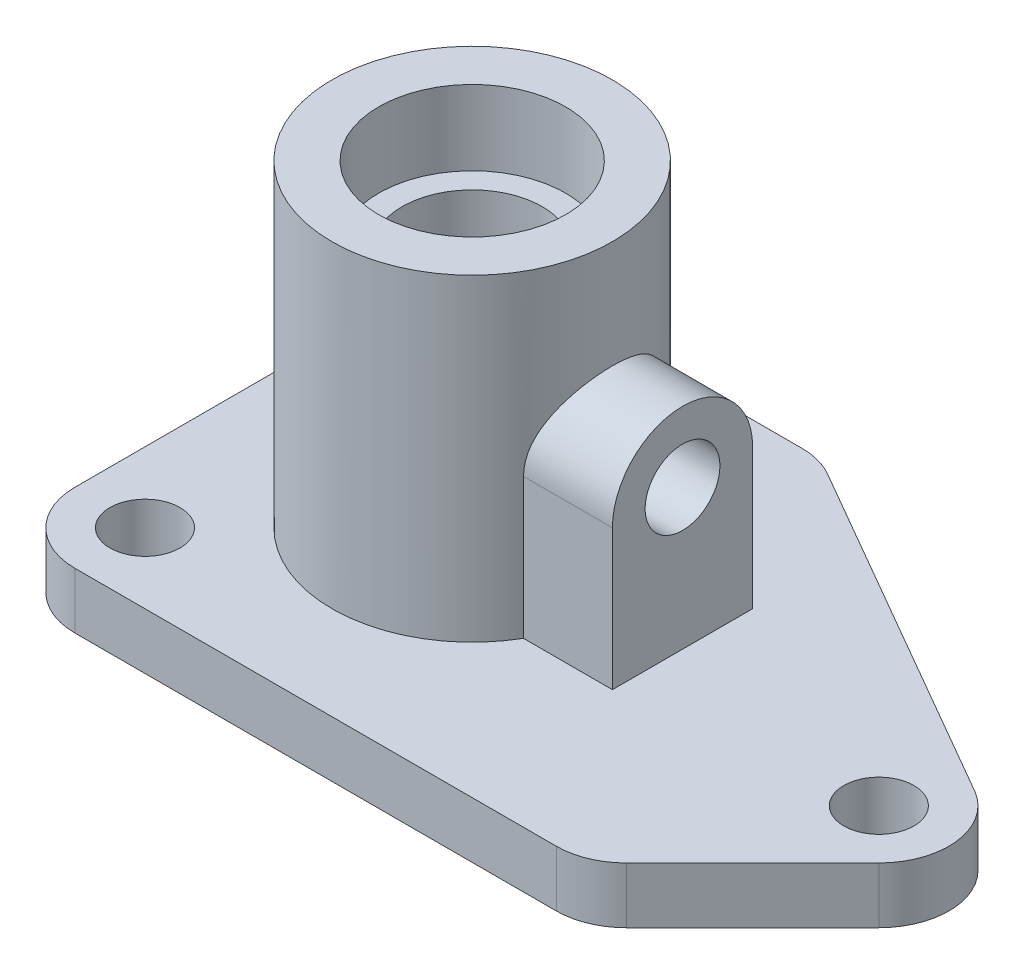
ISO-10303-21;
HEADER;
FILE_DESCRIPTION(('STEP AP214'),'2;1');
FILE_NAME('part.step','',(''),(''),'','','');
FILE_SCHEMA(('AUTOMOTIVE_DESIGN { 1 0 10303 214 1 1 1 1 }'));
ENDSEC;
DATA;
#1=APPLICATION_CONTEXT('core data for automotive mechanical design processes');
#2=APPLICATION_PROTOCOL_DEFINITION('international standard','automotive_design',2000,#1);
#3=PRODUCT_CONTEXT('',#1,'mechanical');
#4=PRODUCT('Part','Part','',(#3));
#5=PRODUCT_RELATED_PRODUCT_CATEGORY('part','',(#4));
#6=PRODUCT_DEFINITION_FORMATION('','',#4);
#7=PRODUCT_DEFINITION_CONTEXT('part definition',#1,'design');
#8=PRODUCT_DEFINITION('design','',#6,#7);
#9=PRODUCT_DEFINITION_SHAPE('','',#8);
#10=(LENGTH_UNIT() NAMED_UNIT(*) SI_UNIT(.MILLI.,.METRE.));
#11=(NAMED_UNIT(*) PLANE_ANGLE_UNIT() SI_UNIT($,.RADIAN.));
#12=(NAMED_UNIT(*) SI_UNIT($,.STERADIAN.) SOLID_ANGLE_UNIT());
#13=UNCERTAINTY_MEASURE_WITH_UNIT(LENGTH_MEASURE(1.E-05),#10,'distance_accuracy_value','');
#14=(GEOMETRIC_REPRESENTATION_CONTEXT(3) GLOBAL_UNCERTAINTY_ASSIGNED_CONTEXT((#13)) GLOBAL_UNIT_ASSIGNED_CONTEXT((#10,
#11,#12)) REPRESENTATION_CONTEXT('',''));
#15=CARTESIAN_POINT('',(0.,0.,0.));
#16=DIRECTION('',(0.,0.,1.));
#17=DIRECTION('',(1.,0.,0.));
#18=AXIS2_PLACEMENT_3D('',#15,#16,#17);
#19=CARTESIAN_POINT('',(68.0000000000001,12.,35.));
#20=DIRECTION('',(0.,1.,0.));
#21=DIRECTION('',(0.,0.,1.));
#22=AXIS2_PLACEMENT_3D('',#19,#20,#21);
#23=PLANE('',#22);
#24=DIRECTION('',(1.,0.,0.));
#25=VECTOR('',#24,1.);
#26=CARTESIAN_POINT('',(-50.001,12.,15.));
#27=LINE('',#26,#25);
#28=CARTESIAN_POINT('',(25.9807621135332,12.,15.));
#29=VERTEX_POINT('',#28);
#30=CARTESIAN_POINT('',(45.,12.,15.));
#31=VERTEX_POINT('',#30);
#32=EDGE_CURVE('E264',#29,#31,#27,.T.);
#33=ORIENTED_EDGE('',*,*,#32,.F.);
#34=CARTESIAN_POINT('',(0.,12.,0.));
#35=DIRECTION('',(0.,1.,0.));
#36=DIRECTION('',(0.,0.,1.));
#37=AXIS2_PLACEMENT_3D('',#34,#35,#36);
#38=CIRCLE('',#37,30.);
#39=CARTESIAN_POINT('',(25.9807621135332,12.,-15.));
#40=VERTEX_POINT('',#39);
#41=EDGE_CURVE('E239',#40,#29,#38,.T.);
#42=ORIENTED_EDGE('',*,*,#41,.F.);
#43=DIRECTION('',(1.,0.,0.));
#44=VECTOR('',#43,1.);
#45=CARTESIAN_POINT('',(-50.001,12.,-15.));
#46=LINE('',#45,#44);
#47=CARTESIAN_POINT('',(45.,12.,-15.));
#48=VERTEX_POINT('',#47);
#49=EDGE_CURVE('E268',#40,#48,#46,.T.);
#50=ORIENTED_EDGE('',*,*,#49,.T.);
#51=DIRECTION('',(0.,0.,-1.));
#52=VECTOR('',#51,1.);
#53=CARTESIAN_POINT('',(45.,12.,15.));
#54=LINE('',#53,#52);
#55=EDGE_CURVE('E274',#31,#48,#54,.T.);
#56=ORIENTED_EDGE('',*,*,#55,.F.);
#57=EDGE_LOOP('',(#33,#42,#50,#56));
#58=FACE_BOUND('',#57,.T.);
#59=CARTESIAN_POINT('',(-35.,12.,-35.));
#60=DIRECTION('',(0.,1.,0.));
#61=DIRECTION('',(0.,0.,1.));
#62=AXIS2_PLACEMENT_3D('',#59,#60,#61);
#63=CIRCLE('',#62,7.5);
#64=CARTESIAN_POINT('',(-35.,12.,-27.5));
#65=VERTEX_POINT('',#64);
#66=EDGE_CURVE('E224',#65,#65,#63,.T.);
#67=ORIENTED_EDGE('',*,*,#66,.F.);
#68=EDGE_LOOP('',(#67));
#69=FACE_BOUND('',#68,.T.);
#70=CARTESIAN_POINT('',(68.0000000000001,12.,35.));
#71=DIRECTION('',(0.,1.,0.));
#72=DIRECTION('',(0.,0.,1.));
#73=AXIS2_PLACEMENT_3D('',#70,#71,#72);
#74=CIRCLE('',#73,15.);
#75=CARTESIAN_POINT('',(68.0000000000001,12.,50.));
#76=VERTEX_POINT('',#75);
#77=CARTESIAN_POINT('',(78.6066017177983,12.,45.6066017177982));
#78=VERTEX_POINT('',#77);
#79=EDGE_CURVE('E173',#76,#78,#74,.T.);
#80=ORIENTED_EDGE('',*,*,#79,.T.);
#81=DIRECTION('',(0.707106781186547,0.,-0.707106781186548));
#82=VECTOR('',#81,1.);
#83=CARTESIAN_POINT('',(78.6066017177983,12.,45.6066017177982));
#84=LINE('',#83,#82);
#85=CARTESIAN_POINT('',(105.606601717798,12.,18.6066017177982));
#86=VERTEX_POINT('',#85);
#87=EDGE_CURVE('E104',#78,#86,#84,.T.);
#88=ORIENTED_EDGE('',*,*,#87,.T.);
#89=CARTESIAN_POINT('',(95.,12.,8.));
#90=DIRECTION('',(0.,1.,0.));
#91=DIRECTION('',(0.,0.,1.));
#92=AXIS2_PLACEMENT_3D('',#89,#90,#91);
#93=CIRCLE('',#92,15.);
#94=CARTESIAN_POINT('',(102.5,12.,-4.99038105676657));
#95=VERTEX_POINT('',#94);
#96=EDGE_CURVE('E194',#86,#95,#93,.T.);
#97=ORIENTED_EDGE('',*,*,#96,.T.);
#98=DIRECTION('',(-0.866025403784438,0.,-0.500000000000001));
#99=VECTOR('',#98,1.);
#100=CARTESIAN_POINT('',(28.0218152745385,12.,-47.9903810567666));
#101=LINE('',#100,#99);
#102=CARTESIAN_POINT('',(28.0218152745385,12.,-47.9903810567666));
#103=VERTEX_POINT('',#102);
#104=EDGE_CURVE('E213',#95,#103,#101,.T.);
#105=ORIENTED_EDGE('',*,*,#104,.T.);
#106=CARTESIAN_POINT('',(20.5218152745385,12.,-35.));
#107=DIRECTION('',(0.,1.,0.));
#108=DIRECTION('',(0.,0.,-1.));
#109=AXIS2_PLACEMENT_3D('',#106,#107,#108);
#110=CIRCLE('',#109,15.);
#111=CARTESIAN_POINT('',(20.5218152745385,12.,-50.));
#112=VERTEX_POINT('',#111);
#113=EDGE_CURVE('E210',#103,#112,#110,.T.);
#114=ORIENTED_EDGE('',*,*,#113,.T.);
#115=DIRECTION('',(-1.,0.,0.));
#116=VECTOR('',#115,1.);
#117=CARTESIAN_POINT('',(-34.9999999999999,12.,-50.));
#118=LINE('',#117,#116);
#119=CARTESIAN_POINT('',(-35.,12.,-50.));
#120=VERTEX_POINT('',#119);
#121=EDGE_CURVE('E212',#112,#120,#118,.T.);
#122=ORIENTED_EDGE('',*,*,#121,.T.);
#123=CARTESIAN_POINT('',(-35.,12.,-35.));
#124=DIRECTION('',(0.,1.,0.));
#125=DIRECTION('',(0.,0.,-1.));
#126=AXIS2_PLACEMENT_3D('',#123,#124,#125);
#127=CIRCLE('',#126,15.);
#128=CARTESIAN_POINT('',(-50.,12.,-34.9999999999999));
#129=VERTEX_POINT('',#128);
#130=EDGE_CURVE('E132',#120,#129,#127,.T.);
#131=ORIENTED_EDGE('',*,*,#130,.T.);
#132=DIRECTION('',(0.,0.,1.));
#133=VECTOR('',#132,1.);
#134=CARTESIAN_POINT('',(-50.,12.,-34.9999999999999));
#135=LINE('',#134,#133);
#136=CARTESIAN_POINT('',(-50.,12.,34.9999999999999));
#137=VERTEX_POINT('',#136);
#138=EDGE_CURVE('E125',#129,#137,#135,.T.);
#139=ORIENTED_EDGE('',*,*,#138,.T.);
#140=CARTESIAN_POINT('',(-35.,12.,35.));
#141=DIRECTION('',(0.,1.,0.));
#142=DIRECTION('',(0.,0.,1.));
#143=AXIS2_PLACEMENT_3D('',#140,#141,#142);
#144=CIRCLE('',#143,15.);
#145=CARTESIAN_POINT('',(-34.9999999999999,12.,50.));
#146=VERTEX_POINT('',#145);
#147=EDGE_CURVE('E129',#137,#146,#144,.T.);
#148=ORIENTED_EDGE('',*,*,#147,.T.);
#149=DIRECTION('',(1.,0.,0.));
#150=VECTOR('',#149,1.);
#151=CARTESIAN_POINT('',(-34.9999999999999,12.,50.));
#152=LINE('',#151,#150);
#153=EDGE_CURVE('E57',#146,#76,#152,.T.);
#154=ORIENTED_EDGE('',*,*,#153,.T.);
#155=EDGE_LOOP('',(#80,#88,#97,#105,#114,#122,#131,#139,#148,#154));
#156=FACE_BOUND('',#155,.T.);
#157=CARTESIAN_POINT('',(95.,12.,8.));
#158=DIRECTION('',(0.,1.,0.));
#159=DIRECTION('',(0.,0.,1.));
#160=AXIS2_PLACEMENT_3D('',#157,#158,#159);
#161=CIRCLE('',#160,7.50000000000001);
#162=CARTESIAN_POINT('',(95.,12.,15.5));
#163=VERTEX_POINT('',#162);
#164=EDGE_CURVE('E157',#163,#163,#161,.T.);
#165=ORIENTED_EDGE('',*,*,#164,.F.);
#166=EDGE_LOOP('',(#165));
#167=FACE_BOUND('',#166,.T.);
#168=CARTESIAN_POINT('',(-35.,12.,35.));
#169=DIRECTION('',(0.,1.,0.));
#170=DIRECTION('',(0.,0.,1.));
#171=AXIS2_PLACEMENT_3D('',#168,#169,#170);
#172=CIRCLE('',#171,7.5);
#173=CARTESIAN_POINT('',(-35.,12.,42.5));
#174=VERTEX_POINT('',#173);
#175=EDGE_CURVE('E230',#174,#174,#172,.T.);
#176=ORIENTED_EDGE('',*,*,#175,.F.);
#177=EDGE_LOOP('',(#176));
#178=FACE_BOUND('',#177,.T.);
#179=ADVANCED_FACE('F33',(#58,#69,#156,#167,#178),#23,.T.);
#180=CARTESIAN_POINT('',(68.0000000000001,0.,35.));
#181=DIRECTION('',(0.,1.,0.));
#182=DIRECTION('',(0.,0.,1.));
#183=AXIS2_PLACEMENT_3D('',#180,#181,#182);
#184=PLANE('',#183);
#185=CARTESIAN_POINT('',(0.,0.,0.));
#186=DIRECTION('',(0.,1.,0.));
#187=DIRECTION('',(0.,0.,1.));
#188=AXIS2_PLACEMENT_3D('',#185,#186,#187);
#189=CIRCLE('',#188,15.);
#190=CARTESIAN_POINT('',(0.,0.,15.));
#191=VERTEX_POINT('',#190);
#192=EDGE_CURVE('E242',#191,#191,#189,.T.);
#193=ORIENTED_EDGE('',*,*,#192,.T.);
#194=EDGE_LOOP('',(#193));
#195=FACE_BOUND('',#194,.T.);
#196=CARTESIAN_POINT('',(68.0000000000001,0.,35.));
#197=DIRECTION('',(0.,1.,0.));
#198=DIRECTION('',(0.,0.,1.));
#199=AXIS2_PLACEMENT_3D('',#196,#197,#198);
#200=CIRCLE('',#199,15.);
#201=CARTESIAN_POINT('',(68.0000000000001,0.,50.));
#202=VERTEX_POINT('',#201);
#203=CARTESIAN_POINT('',(78.6066017177983,0.,45.6066017177982));
#204=VERTEX_POINT('',#203);
#205=EDGE_CURVE('E153',#202,#204,#200,.T.);
#206=ORIENTED_EDGE('',*,*,#205,.F.);
#207=DIRECTION('',(1.,0.,0.));
#208=VECTOR('',#207,1.);
#209=CARTESIAN_POINT('',(-34.9999999999999,0.,50.));
#210=LINE('',#209,#208);
#211=CARTESIAN_POINT('',(-34.9999999999999,0.,50.));
#212=VERTEX_POINT('',#211);
#213=EDGE_CURVE('E96',#212,#202,#210,.T.);
#214=ORIENTED_EDGE('',*,*,#213,.F.);
#215=CARTESIAN_POINT('',(-35.,0.,35.));
#216=DIRECTION('',(0.,1.,0.));
#217=DIRECTION('',(0.,0.,1.));
#218=AXIS2_PLACEMENT_3D('',#215,#216,#217);
#219=CIRCLE('',#218,15.);
#220=CARTESIAN_POINT('',(-50.,0.,34.9999999999999));
#221=VERTEX_POINT('',#220);
#222=EDGE_CURVE('E170',#221,#212,#219,.T.);
#223=ORIENTED_EDGE('',*,*,#222,.F.);
#224=DIRECTION('',(0.,0.,1.));
#225=VECTOR('',#224,1.);
#226=CARTESIAN_POINT('',(-50.,0.,-34.9999999999999));
#227=LINE('',#226,#225);
#228=CARTESIAN_POINT('',(-50.,0.,-34.9999999999999));
#229=VERTEX_POINT('',#228);
#230=EDGE_CURVE('E141',#229,#221,#227,.T.);
#231=ORIENTED_EDGE('',*,*,#230,.F.);
#232=CARTESIAN_POINT('',(-35.,0.,-35.));
#233=DIRECTION('',(0.,1.,0.));
#234=DIRECTION('',(0.,0.,-1.));
#235=AXIS2_PLACEMENT_3D('',#232,#233,#234);
#236=CIRCLE('',#235,15.);
#237=CARTESIAN_POINT('',(-35.,0.,-50.));
#238=VERTEX_POINT('',#237);
#239=EDGE_CURVE('E167',#238,#229,#236,.T.);
#240=ORIENTED_EDGE('',*,*,#239,.F.);
#241=DIRECTION('',(-1.,0.,0.));
#242=VECTOR('',#241,1.);
#243=CARTESIAN_POINT('',(-34.9999999999999,0.,-50.));
#244=LINE('',#243,#242);
#245=CARTESIAN_POINT('',(20.5218152745385,0.,-50.));
#246=VERTEX_POINT('',#245);
#247=EDGE_CURVE('E165',#246,#238,#244,.T.);
#248=ORIENTED_EDGE('',*,*,#247,.F.);
#249=CARTESIAN_POINT('',(20.5218152745385,0.,-35.));
#250=DIRECTION('',(0.,1.,0.));
#251=DIRECTION('',(0.,0.,-1.));
#252=AXIS2_PLACEMENT_3D('',#249,#250,#251);
#253=CIRCLE('',#252,15.);
#254=CARTESIAN_POINT('',(28.0218152745385,0.,-47.9903810567666));
#255=VERTEX_POINT('',#254);
#256=EDGE_CURVE('E163',#255,#246,#253,.T.);
#257=ORIENTED_EDGE('',*,*,#256,.F.);
#258=DIRECTION('',(-0.866025403784438,0.,-0.500000000000001));
#259=VECTOR('',#258,1.);
#260=CARTESIAN_POINT('',(28.0218152745385,0.,-47.9903810567666));
#261=LINE('',#260,#259);
#262=CARTESIAN_POINT('',(102.5,0.,-4.99038105676657));
#263=VERTEX_POINT('',#262);
#264=EDGE_CURVE('E161',#263,#255,#261,.T.);
#265=ORIENTED_EDGE('',*,*,#264,.F.);
#266=CARTESIAN_POINT('',(95.,0.,8.));
#267=DIRECTION('',(0.,1.,0.));
#268=DIRECTION('',(0.,0.,1.));
#269=AXIS2_PLACEMENT_3D('',#266,#267,#268);
#270=CIRCLE('',#269,15.);
#271=CARTESIAN_POINT('',(105.606601717798,0.,18.6066017177982));
#272=VERTEX_POINT('',#271);
#273=EDGE_CURVE('E159',#272,#263,#270,.T.);
#274=ORIENTED_EDGE('',*,*,#273,.F.);
#275=DIRECTION('',(0.707106781186547,0.,-0.707106781186548));
#276=VECTOR('',#275,1.);
#277=CARTESIAN_POINT('',(78.6066017177983,0.,45.6066017177982));
#278=LINE('',#277,#276);
#279=EDGE_CURVE('E156',#204,#272,#278,.T.);
#280=ORIENTED_EDGE('',*,*,#279,.F.);
#281=EDGE_LOOP('',(#206,#214,#223,#231,#240,#248,#257,#265,#274,#280));
#282=FACE_BOUND('',#281,.T.);
#283=CARTESIAN_POINT('',(95.,0.,8.));
#284=DIRECTION('',(0.,1.,0.));
#285=DIRECTION('',(0.,0.,1.));
#286=AXIS2_PLACEMENT_3D('',#283,#284,#285);
#287=CIRCLE('',#286,7.50000000000001);
#288=CARTESIAN_POINT('',(95.,0.,15.5));
#289=VERTEX_POINT('',#288);
#290=EDGE_CURVE('E221',#289,#289,#287,.T.);
#291=ORIENTED_EDGE('',*,*,#290,.T.);
#292=EDGE_LOOP('',(#291));
#293=FACE_BOUND('',#292,.T.);
#294=CARTESIAN_POINT('',(-35.,0.,-35.));
#295=DIRECTION('',(0.,1.,0.));
#296=DIRECTION('',(0.,0.,1.));
#297=AXIS2_PLACEMENT_3D('',#294,#295,#296);
#298=CIRCLE('',#297,7.5);
#299=CARTESIAN_POINT('',(-35.,0.,-27.5));
#300=VERTEX_POINT('',#299);
#301=EDGE_CURVE('E227',#300,#300,#298,.T.);
#302=ORIENTED_EDGE('',*,*,#301,.T.);
#303=EDGE_LOOP('',(#302));
#304=FACE_BOUND('',#303,.T.);
#305=CARTESIAN_POINT('',(-35.,0.,35.));
#306=DIRECTION('',(0.,1.,0.));
#307=DIRECTION('',(0.,0.,1.));
#308=AXIS2_PLACEMENT_3D('',#305,#306,#307);
#309=CIRCLE('',#308,7.5);
#310=CARTESIAN_POINT('',(-35.,0.,42.5));
#311=VERTEX_POINT('',#310);
#312=EDGE_CURVE('E233',#311,#311,#309,.T.);
#313=ORIENTED_EDGE('',*,*,#312,.T.);
#314=EDGE_LOOP('',(#313));
#315=FACE_BOUND('',#314,.T.);
#316=ADVANCED_FACE('F198',(#195,#282,#293,#304,#315),#184,.F.);
#317=CARTESIAN_POINT('',(68.0000000000001,12.,35.));
#318=DIRECTION('',(0.,-1.,0.));
#319=DIRECTION('',(0.,0.,-1.));
#320=AXIS2_PLACEMENT_3D('',#317,#318,#319);
#321=CYLINDRICAL_SURFACE('',#320,15.);
#322=ORIENTED_EDGE('',*,*,#205,.T.);
#323=DIRECTION('',(0.,-1.,0.));
#324=VECTOR('',#323,1.);
#325=CARTESIAN_POINT('',(78.6066017177983,12.,45.6066017177982));
#326=LINE('',#325,#324);
#327=EDGE_CURVE('E11',#78,#204,#326,.T.);
#328=ORIENTED_EDGE('',*,*,#327,.F.);
#329=ORIENTED_EDGE('',*,*,#79,.F.);
#330=DIRECTION('',(0.,-1.,0.));
#331=VECTOR('',#330,1.);
#332=CARTESIAN_POINT('',(68.0000000000001,12.,50.));
#333=LINE('',#332,#331);
#334=EDGE_CURVE('E149',#76,#202,#333,.T.);
#335=ORIENTED_EDGE('',*,*,#334,.T.);
#336=EDGE_LOOP('',(#322,#328,#329,#335));
#337=FACE_BOUND('',#336,.T.);
#338=ADVANCED_FACE('F35',(#337),#321,.T.);
#339=CARTESIAN_POINT('',(78.6066017177983,12.,45.6066017177982));
#340=DIRECTION('',(-0.707106781186548,0.,-0.707106781186547));
#341=DIRECTION('',(-0.707106781186547,0.,0.707106781186548));
#342=AXIS2_PLACEMENT_3D('',#339,#340,#341);
#343=PLANE('',#342);
#344=ORIENTED_EDGE('',*,*,#279,.T.);
#345=DIRECTION('',(0.,-1.,0.));
#346=VECTOR('',#345,1.);
#347=CARTESIAN_POINT('',(105.606601717798,12.,18.6066017177982));
#348=LINE('',#347,#346);
#349=EDGE_CURVE('E41',#86,#272,#348,.T.);
#350=ORIENTED_EDGE('',*,*,#349,.F.);
#351=ORIENTED_EDGE('',*,*,#87,.F.);
#352=ORIENTED_EDGE('',*,*,#327,.T.);
#353=EDGE_LOOP('',(#344,#350,#351,#352));
#354=FACE_BOUND('',#353,.T.);
#355=ADVANCED_FACE('F354',(#354),#343,.F.);
#356=CARTESIAN_POINT('',(95.,12.,8.));
#357=DIRECTION('',(0.,-1.,0.));
#358=DIRECTION('',(0.,0.,-1.));
#359=AXIS2_PLACEMENT_3D('',#356,#357,#358);
#360=CYLINDRICAL_SURFACE('',#359,15.);
#361=ORIENTED_EDGE('',*,*,#273,.T.);
#362=DIRECTION('',(0.,-1.,0.));
#363=VECTOR('',#362,1.);
#364=CARTESIAN_POINT('',(102.5,12.,-4.99038105676657));
#365=LINE('',#364,#363);
#366=EDGE_CURVE('E186',#95,#263,#365,.T.);
#367=ORIENTED_EDGE('',*,*,#366,.F.);
#368=ORIENTED_EDGE('',*,*,#96,.F.);
#369=ORIENTED_EDGE('',*,*,#349,.T.);
#370=EDGE_LOOP('',(#361,#367,#368,#369));
#371=FACE_BOUND('',#370,.T.);
#372=ADVANCED_FACE('F192',(#371),#360,.T.);
#373=CARTESIAN_POINT('',(28.0218152745385,12.,-47.9903810567666));
#374=DIRECTION('',(-0.500000000000001,0.,0.866025403784438));
#375=DIRECTION('',(0.866025403784438,0.,0.500000000000001));
#376=AXIS2_PLACEMENT_3D('',#373,#374,#375);
#377=PLANE('',#376);
#378=ORIENTED_EDGE('',*,*,#264,.T.);
#379=DIRECTION('',(0.,-1.,0.));
#380=VECTOR('',#379,1.);
#381=CARTESIAN_POINT('',(28.0218152745385,12.,-47.9903810567666));
#382=LINE('',#381,#380);
#383=EDGE_CURVE('E183',#103,#255,#382,.T.);
#384=ORIENTED_EDGE('',*,*,#383,.F.);
#385=ORIENTED_EDGE('',*,*,#104,.F.);
#386=ORIENTED_EDGE('',*,*,#366,.T.);
#387=EDGE_LOOP('',(#378,#384,#385,#386));
#388=FACE_BOUND('',#387,.T.);
#389=ADVANCED_FACE('F204',(#388),#377,.F.);
#390=CARTESIAN_POINT('',(20.5218152745385,12.,-35.));
#391=DIRECTION('',(0.,-1.,0.));
#392=DIRECTION('',(0.,0.,-1.));
#393=AXIS2_PLACEMENT_3D('',#390,#391,#392);
#394=CYLINDRICAL_SURFACE('',#393,15.);
#395=ORIENTED_EDGE('',*,*,#256,.T.);
#396=DIRECTION('',(0.,-1.,0.));
#397=VECTOR('',#396,1.);
#398=CARTESIAN_POINT('',(20.5218152745385,12.,-50.));
#399=LINE('',#398,#397);
#400=EDGE_CURVE('E180',#112,#246,#399,.T.);
#401=ORIENTED_EDGE('',*,*,#400,.F.);
#402=ORIENTED_EDGE('',*,*,#113,.F.);
#403=ORIENTED_EDGE('',*,*,#383,.T.);
#404=EDGE_LOOP('',(#395,#401,#402,#403));
#405=FACE_BOUND('',#404,.T.);
#406=ADVANCED_FACE('F208',(#405),#394,.T.);
#407=CARTESIAN_POINT('',(-34.9999999999999,12.,-50.));
#408=DIRECTION('',(0.,0.,1.));
#409=DIRECTION('',(1.,0.,0.));
#410=AXIS2_PLACEMENT_3D('',#407,#408,#409);
#411=PLANE('',#410);
#412=ORIENTED_EDGE('',*,*,#247,.T.);
#413=DIRECTION('',(0.,-1.,0.));
#414=VECTOR('',#413,1.);
#415=CARTESIAN_POINT('',(-35.,12.,-50.));
#416=LINE('',#415,#414);
#417=EDGE_CURVE('E177',#120,#238,#416,.T.);
#418=ORIENTED_EDGE('',*,*,#417,.F.);
#419=ORIENTED_EDGE('',*,*,#121,.F.);
#420=ORIENTED_EDGE('',*,*,#400,.T.);
#421=EDGE_LOOP('',(#412,#418,#419,#420));
#422=FACE_BOUND('',#421,.T.);
#423=ADVANCED_FACE('F344',(#422),#411,.F.);
#424=CARTESIAN_POINT('',(-35.,12.,-35.));
#425=DIRECTION('',(0.,-1.,0.));
#426=DIRECTION('',(0.,0.,-1.));
#427=AXIS2_PLACEMENT_3D('',#424,#425,#426);
#428=CYLINDRICAL_SURFACE('',#427,15.);
#429=ORIENTED_EDGE('',*,*,#239,.T.);
#430=DIRECTION('',(0.,-1.,0.));
#431=VECTOR('',#430,1.);
#432=CARTESIAN_POINT('',(-50.,12.,-34.9999999999999));
#433=LINE('',#432,#431);
#434=EDGE_CURVE('E144',#129,#229,#433,.T.);
#435=ORIENTED_EDGE('',*,*,#434,.F.);
#436=ORIENTED_EDGE('',*,*,#130,.F.);
#437=ORIENTED_EDGE('',*,*,#417,.T.);
#438=EDGE_LOOP('',(#429,#435,#436,#437));
#439=FACE_BOUND('',#438,.T.);
#440=ADVANCED_FACE('F341',(#439),#428,.T.);
#441=CARTESIAN_POINT('',(-50.,12.,-34.9999999999999));
#442=DIRECTION('',(1.,0.,0.));
#443=DIRECTION('',(0.,0.,-1.));
#444=AXIS2_PLACEMENT_3D('',#441,#442,#443);
#445=PLANE('',#444);
#446=ORIENTED_EDGE('',*,*,#230,.T.);
#447=DIRECTION('',(0.,-1.,0.));
#448=VECTOR('',#447,1.);
#449=CARTESIAN_POINT('',(-50.,12.,34.9999999999999));
#450=LINE('',#449,#448);
#451=EDGE_CURVE('E138',#137,#221,#450,.T.);
#452=ORIENTED_EDGE('',*,*,#451,.F.);
#453=ORIENTED_EDGE('',*,*,#138,.F.);
#454=ORIENTED_EDGE('',*,*,#434,.T.);
#455=EDGE_LOOP('',(#446,#452,#453,#454));
#456=FACE_BOUND('',#455,.T.);
#457=ADVANCED_FACE('F139',(#456),#445,.F.);
#458=CARTESIAN_POINT('',(-35.,12.,35.));
#459=DIRECTION('',(0.,-1.,0.));
#460=DIRECTION('',(0.,0.,-1.));
#461=AXIS2_PLACEMENT_3D('',#458,#459,#460);
#462=CYLINDRICAL_SURFACE('',#461,15.);
#463=ORIENTED_EDGE('',*,*,#222,.T.);
#464=DIRECTION('',(0.,-1.,0.));
#465=VECTOR('',#464,1.);
#466=CARTESIAN_POINT('',(-34.9999999999999,12.,50.));
#467=LINE('',#466,#465);
#468=EDGE_CURVE('E145',#146,#212,#467,.T.);
#469=ORIENTED_EDGE('',*,*,#468,.F.);
#470=ORIENTED_EDGE('',*,*,#147,.F.);
#471=ORIENTED_EDGE('',*,*,#451,.T.);
#472=EDGE_LOOP('',(#463,#469,#470,#471));
#473=FACE_BOUND('',#472,.T.);
#474=ADVANCED_FACE('F147',(#473),#462,.T.);
#475=CARTESIAN_POINT('',(-34.9999999999999,12.,50.));
#476=DIRECTION('',(0.,0.,-1.));
#477=DIRECTION('',(-1.,0.,0.));
#478=AXIS2_PLACEMENT_3D('',#475,#476,#477);
#479=PLANE('',#478);
#480=ORIENTED_EDGE('',*,*,#213,.T.);
#481=ORIENTED_EDGE('',*,*,#334,.F.);
#482=ORIENTED_EDGE('',*,*,#153,.F.);
#483=ORIENTED_EDGE('',*,*,#468,.T.);
#484=EDGE_LOOP('',(#480,#481,#482,#483));
#485=FACE_BOUND('',#484,.T.);
#486=ADVANCED_FACE('F334',(#485),#479,.F.);
#487=CARTESIAN_POINT('',(95.,12.,8.));
#488=DIRECTION('',(0.,-1.,0.));
#489=DIRECTION('',(0.,0.,-1.));
#490=AXIS2_PLACEMENT_3D('',#487,#488,#489);
#491=CYLINDRICAL_SURFACE('',#490,7.50000000000001);
#492=ORIENTED_EDGE('',*,*,#164,.T.);
#493=EDGE_LOOP('',(#492));
#494=FACE_BOUND('',#493,.T.);
#495=ORIENTED_EDGE('',*,*,#290,.F.);
#496=EDGE_LOOP('',(#495));
#497=FACE_BOUND('',#496,.T.);
#498=ADVANCED_FACE('F331',(#494,#497),#491,.F.);
#499=CARTESIAN_POINT('',(-35.,12.,-35.));
#500=DIRECTION('',(0.,-1.,0.));
#501=DIRECTION('',(0.,0.,-1.));
#502=AXIS2_PLACEMENT_3D('',#499,#500,#501);
#503=CYLINDRICAL_SURFACE('',#502,7.5);
#504=ORIENTED_EDGE('',*,*,#66,.T.);
#505=EDGE_LOOP('',(#504));
#506=FACE_BOUND('',#505,.T.);
#507=ORIENTED_EDGE('',*,*,#301,.F.);
#508=EDGE_LOOP('',(#507));
#509=FACE_BOUND('',#508,.T.);
#510=ADVANCED_FACE('F501',(#506,#509),#503,.F.);
#511=CARTESIAN_POINT('',(-35.,12.,35.));
#512=DIRECTION('',(0.,-1.,0.));
#513=DIRECTION('',(0.,0.,-1.));
#514=AXIS2_PLACEMENT_3D('',#511,#512,#513);
#515=CYLINDRICAL_SURFACE('',#514,7.5);
#516=ORIENTED_EDGE('',*,*,#175,.T.);
#517=EDGE_LOOP('',(#516));
#518=FACE_BOUND('',#517,.T.);
#519=ORIENTED_EDGE('',*,*,#312,.F.);
#520=EDGE_LOOP('',(#519));
#521=FACE_BOUND('',#520,.T.);
#522=ADVANCED_FACE('F377',(#518,#521),#515,.F.);
#523=CARTESIAN_POINT('',(0.,80.,0.));
#524=DIRECTION('',(0.,-1.,0.));
#525=DIRECTION('',(0.,0.,-1.));
#526=AXIS2_PLACEMENT_3D('',#523,#524,#525);
#527=CYLINDRICAL_SURFACE('',#526,30.);
#528=CARTESIAN_POINT('',(0.,80.,0.));
#529=DIRECTION('',(0.,1.,0.));
#530=DIRECTION('',(0.,0.,1.));
#531=AXIS2_PLACEMENT_3D('',#528,#529,#530);
#532=CIRCLE('',#531,30.);
#533=CARTESIAN_POINT('',(0.,80.,30.));
#534=VERTEX_POINT('',#533);
#535=EDGE_CURVE('E236',#534,#534,#532,.T.);
#536=ORIENTED_EDGE('',*,*,#535,.F.);
#537=EDGE_LOOP('',(#536));
#538=FACE_BOUND('',#537,.T.);
#539=ORIENTED_EDGE('',*,*,#41,.T.);
#540=DIRECTION('',(0.,-1.,0.));
#541=VECTOR('',#540,1.);
#542=CARTESIAN_POINT('',(25.9807621135332,80.,15.));
#543=LINE('',#542,#541);
#544=CARTESIAN_POINT('',(25.9807621135332,42.,15.));
#545=VERTEX_POINT('',#544);
#546=EDGE_CURVE('E257',#545,#29,#543,.T.);
#547=ORIENTED_EDGE('',*,*,#546,.F.);
#548=CARTESIAN_POINT('',(25.9807621135332,42.,-15.));
#549=CARTESIAN_POINT('',(25.9807576058378,42.1964211737014,-15.0000014586861));
#550=CARTESIAN_POINT('',(25.9829905380631,42.3928145922056,-14.9961410253277));
#551=CARTESIAN_POINT('',(25.9918850828363,42.7851904161284,-14.9807217891875));
#552=CARTESIAN_POINT('',(25.9985465080492,42.9811728385814,-14.96916331205));
#553=CARTESIAN_POINT('',(26.0250894816853,43.5676631493245,-14.9230045872709));
#554=CARTESIAN_POINT('',(26.0515298833532,43.9570488234314,-14.8769209519161));
#555=CARTESIAN_POINT('',(26.1207142812993,44.7272936541326,-14.7551046213978));
#556=CARTESIAN_POINT('',(26.1633639655667,45.108188888957,-14.6795433725615));
#557=CARTESIAN_POINT('',(26.2634626880331,45.8611836057245,-14.4996932012343));
#558=CARTESIAN_POINT('',(26.3209134260895,46.2332820720222,-14.3954009789806));
#559=CARTESIAN_POINT('',(26.4485633992913,46.9655050657005,-14.1594990520545));
#560=CARTESIAN_POINT('',(26.518734375251,47.3256540826482,-14.0279498105325));
#561=CARTESIAN_POINT('',(26.6697691636221,48.0329069485381,-13.7386324656628));
#562=CARTESIAN_POINT('',(26.7506328390558,48.3800109645189,-13.5808646981782));
#563=CARTESIAN_POINT('',(26.9209053023691,49.060004166304,-13.2401344172292));
#564=CARTESIAN_POINT('',(27.0103249671684,49.392874458586,-13.0571396999027));
#565=CARTESIAN_POINT('',(27.1953538928623,50.0426566531954,-12.6672529912251));
#566=CARTESIAN_POINT('',(27.2909654272152,50.359562617126,-12.4603522002049));
#567=CARTESIAN_POINT('',(27.4940416013945,51.0012428652471,-12.0060202915584));
#568=CARTESIAN_POINT('',(27.6018366884021,51.3245475353844,-11.7566593246679));
#569=CARTESIAN_POINT('',(27.819160525639,51.9494487341284,-11.2327527557754));
#570=CARTESIAN_POINT('',(27.9286893641779,52.2510441525934,-10.9582058674764));
#571=CARTESIAN_POINT('',(28.14680386406,52.8311981571442,-10.3851551427764));
#572=CARTESIAN_POINT('',(28.2553891048753,53.1097469004882,-10.0866411766941));
#573=CARTESIAN_POINT('',(28.4689028160071,53.6420726735415,-9.46725117464126));
#574=CARTESIAN_POINT('',(28.5738325019758,53.8958579898596,-9.14638268121823));
#575=CARTESIAN_POINT('',(28.7844701667965,54.3935451769666,-8.46116294354766));
#576=CARTESIAN_POINT('',(28.8897475431564,54.6356069619156,-8.09533855384277));
#577=CARTESIAN_POINT('',(29.0903697156252,55.087806445776,-7.34182448397676));
#578=CARTESIAN_POINT('',(29.1857139389794,55.2979423041286,-6.95413354495458));
#579=CARTESIAN_POINT('',(29.3636813031734,55.684119945096,-6.15953553896398));
#580=CARTESIAN_POINT('',(29.4463105116056,55.8601780000115,-5.75263775937729));
#581=CARTESIAN_POINT('',(29.5964174793187,56.17629340074,-4.92239251726219));
#582=CARTESIAN_POINT('',(29.663896849139,56.3163545735156,-4.49904680888777));
#583=CARTESIAN_POINT('',(29.7774087047019,56.5500422424673,-3.6699275251457));
#584=CARTESIAN_POINT('',(29.8246255092075,56.6462634757717,-3.26504671601562));
#585=CARTESIAN_POINT('',(29.9028443675128,56.8048936810044,-2.44716320047661));
#586=CARTESIAN_POINT('',(29.9338471258446,56.8673041220823,-2.03416084777399));
#587=CARTESIAN_POINT('',(29.9787263678888,56.9574584513599,-1.20366828577204));
#588=CARTESIAN_POINT('',(29.9926113000344,56.9852194407393,-0.786180393006847));
#589=CARTESIAN_POINT('',(30.0028704579857,57.0057430542475,0.0498593842266823));
#590=CARTESIAN_POINT('',(29.999245754939,56.9985078192614,0.468411202044069));
#591=CARTESIAN_POINT('',(29.9756757579812,56.9513038636157,1.26655168861337));
#592=CARTESIAN_POINT('',(29.9571791883982,56.9142405222008,1.64635933784711));
#593=CARTESIAN_POINT('',(29.9061492399208,56.811473775629,2.40109782513101));
#594=CARTESIAN_POINT('',(29.8736168493391,56.745772386977,2.77602900463655));
#595=CARTESIAN_POINT('',(29.7952951631271,56.5864464300131,3.51848760015567));
#596=CARTESIAN_POINT('',(29.749505688478,56.4928214846315,3.8860149161186));
#597=CARTESIAN_POINT('',(29.6457358925711,56.2786004904909,4.61135394314917));
#598=CARTESIAN_POINT('',(29.5877551341968,56.1580034746432,4.96916530533341));
#599=CARTESIAN_POINT('',(29.4600324402276,55.889121511087,5.67784399727617));
#600=CARTESIAN_POINT('',(29.3901396232668,55.7404783498445,6.02854798787315));
#601=CARTESIAN_POINT('',(29.2407172676897,55.4178975177903,6.71596535051411));
#602=CARTESIAN_POINT('',(29.1611877383789,55.2439598714038,7.05267873606751));
#603=CARTESIAN_POINT('',(28.9941837176493,54.8720740739322,7.71054486075649));
#604=CARTESIAN_POINT('',(28.906708375512,54.6741233511239,8.03169592805434));
#605=CARTESIAN_POINT('',(28.725602553475,54.2554426903726,8.65712479172835));
#606=CARTESIAN_POINT('',(28.6319696870863,54.0347039012817,8.96139596067809));
#607=CARTESIAN_POINT('',(28.4314467576268,53.5499074527673,9.57956834503581));
#608=CARTESIAN_POINT('',(28.3241391637724,53.2837277438249,9.89167201563227));
#609=CARTESIAN_POINT('',(28.1070653776815,52.7271978613452,10.4926149232443));
#610=CARTESIAN_POINT('',(27.9972990468664,52.4368463229235,10.7814528447237));
#611=CARTESIAN_POINT('',(27.7779260342178,51.83322355555,11.3347011431183));
#612=CARTESIAN_POINT('',(27.6683195441758,51.5199345930728,11.5990922544793));
#613=CARTESIAN_POINT('',(27.4521400450541,50.8720491314456,12.1018557156901));
#614=CARTESIAN_POINT('',(27.3455675894768,50.5374487800222,12.3402233402459));
#615=CARTESIAN_POINT('',(27.1316776588673,49.8262517650802,12.8039610002847));
#616=CARTESIAN_POINT('',(27.0247557536844,49.4483383836066,13.0275001626447));
#617=CARTESIAN_POINT('',(26.8212607568788,48.6723377378251,13.4414723512563));
#618=CARTESIAN_POINT('',(26.7246828683129,48.2742599518356,13.6319207487682));
#619=CARTESIAN_POINT('',(26.5455193293328,47.4609197560502,13.977598584986));
#620=CARTESIAN_POINT('',(26.4629087118953,47.045689696508,14.1328910384388));
#621=CARTESIAN_POINT('',(26.3148344795481,46.2004001015154,14.4067274523591));
#622=CARTESIAN_POINT('',(26.2493634368079,45.7703470816844,14.5252873358351));
#623=CARTESIAN_POINT('',(26.1593117622387,45.0630628979423,14.686571210157));
#624=CARTESIAN_POINT('',(26.1286151139285,44.7892258891931,14.7410435923467));
#625=CARTESIAN_POINT('',(26.0755516723914,44.2382018693776,14.8347061048737));
#626=CARTESIAN_POINT('',(26.0531825719251,43.9610158082104,14.8739004682971));
#627=CARTESIAN_POINT('',(26.0171763507084,43.4038435038715,14.9367976437121));
#628=CARTESIAN_POINT('',(26.0035543237941,43.1238532626,14.9604736789307));
#629=CARTESIAN_POINT('',(25.9853296531589,42.5625800852335,14.9920878593385));
#630=CARTESIAN_POINT('',(25.9807306970768,42.2812966676836,15.000019569995));
#631=CARTESIAN_POINT('',(25.9807621135332,42.,15.));
#632=B_SPLINE_CURVE_WITH_KNOTS('',3,(#548,#549,#550,#551,#552,#553,#554,#555,#556,#557,#558,
#559,#560,#561,#562,#563,#564,#565,#566,#567,#568,#569,#570,#571,#572,#573,#574,#575,#576,#577,
#578,#579,#580,#581,#582,#583,#584,#585,#586,#587,#588,#589,#590,#591,#592,#593,#594,#595,#596,
#597,#598,#599,#600,#601,#602,#603,#604,#605,#606,#607,#608,#609,#610,#611,#612,#613,#614,#615,
#616,#617,#618,#619,#620,#621,#622,#623,#624,#625,#626,#627,#628,#629,#630,#631),.UNSPECIFIED.,
.F.,.F.,(4,2,2,2,2,2,2,2,2,2,2,2,2,2,2,2,2,2,2,2,2,2,2,2,2,2,2,2,2,2,2,2,2,2,2,2,2,2,2,2,2,4),
(0.,0.589158077480656,1.17829123385306,2.35555703256039,3.52607537567189,4.69672820932809,
5.86481151084261,7.03287985019273,8.20245335695368,9.37245875585782,10.6379774507587,
11.9035608143296,13.1696819211084,14.4353778810607,15.7869844975327,17.1386690058151,
18.4897064778727,19.8406002566331,21.0953807608753,22.350106737908,23.6042132018104,
24.858242947032,26.0030687180118,27.1478138908218,28.2925745225585,29.4373762064918,
30.5979332338978,31.7584891406371,32.9191694490945,34.0803022875584,35.3509282474113,
36.6216260030503,37.8933167590647,39.1652380435005,40.5192232439467,41.8725778024018,
43.2234870079104,44.5738097929056,45.4159682938013,46.2578932914022,47.101267227134,
47.9449857696204),.UNSPECIFIED.);
#633=CARTESIAN_POINT('',(25.9807621135332,42.,-15.));
#634=VERTEX_POINT('',#633);
#635=EDGE_CURVE('E256',#634,#545,#632,.T.);
#636=ORIENTED_EDGE('',*,*,#635,.F.);
#637=DIRECTION('',(0.,-1.,0.));
#638=VECTOR('',#637,1.);
#639=CARTESIAN_POINT('',(25.9807621135332,80.,-15.));
#640=LINE('',#639,#638);
#641=EDGE_CURVE('E48',#634,#40,#640,.T.);
#642=ORIENTED_EDGE('',*,*,#641,.T.);
#643=EDGE_LOOP('',(#539,#547,#636,#642));
#644=FACE_BOUND('',#643,.T.);
#645=ADVANCED_FACE('F388',(#538,#644),#527,.T.);
#646=CARTESIAN_POINT('',(0.,80.,0.));
#647=DIRECTION('',(0.,1.,0.));
#648=DIRECTION('',(0.,0.,1.));
#649=AXIS2_PLACEMENT_3D('',#646,#647,#648);
#650=PLANE('',#649);
#651=CARTESIAN_POINT('',(0.,80.,0.));
#652=DIRECTION('',(0.,1.,0.));
#653=DIRECTION('',(0.,0.,1.));
#654=AXIS2_PLACEMENT_3D('',#651,#652,#653);
#655=CIRCLE('',#654,20.);
#656=CARTESIAN_POINT('',(0.,80.,20.));
#657=VERTEX_POINT('',#656);
#658=EDGE_CURVE('E253',#657,#657,#655,.T.);
#659=ORIENTED_EDGE('',*,*,#658,.F.);
#660=EDGE_LOOP('',(#659));
#661=FACE_BOUND('',#660,.T.);
#662=ORIENTED_EDGE('',*,*,#535,.T.);
#663=EDGE_LOOP('',(#662));
#664=FACE_BOUND('',#663,.T.);
#665=ADVANCED_FACE('F382',(#661,#664),#650,.T.);
#666=CARTESIAN_POINT('',(0.,80.,0.));
#667=DIRECTION('',(0.,1.,0.));
#668=DIRECTION('',(0.,0.,1.));
#669=AXIS2_PLACEMENT_3D('',#666,#667,#668);
#670=CYLINDRICAL_SURFACE('',#669,15.);
#671=CARTESIAN_POINT('',(12.6885775404495,42.,-8.));
#672=CARTESIAN_POINT('',(12.6885765278676,41.7937192721858,-8.00000082721681));
#673=CARTESIAN_POINT('',(12.6936244616965,41.5874478094631,-7.99201174654624));
#674=CARTESIAN_POINT('',(12.7136132089408,41.1765400452813,-7.96017537563484));
#675=CARTESIAN_POINT('',(12.7285577429431,40.9719043880904,-7.93632212130752));
#676=CARTESIAN_POINT('',(12.7677833039786,40.5656970070215,-7.87306095334852));
#677=CARTESIAN_POINT('',(12.7920765809839,40.3641296654285,-7.83363262937667));
#678=CARTESIAN_POINT('',(12.8491080572074,39.9656728398993,-7.73973085972861));
#679=CARTESIAN_POINT('',(12.8818499962724,39.7687854698374,-7.68525075053985));
#680=CARTESIAN_POINT('',(12.9544169307915,39.382225971615,-7.56228385666899));
#681=CARTESIAN_POINT('',(12.9941952837499,39.1925157493011,-7.49388888707303));
#682=CARTESIAN_POINT('',(13.0797616840841,38.8198944209796,-7.3435222093617));
#683=CARTESIAN_POINT('',(13.125551930383,38.636985834318,-7.26154553068372));
#684=CARTESIAN_POINT('',(13.2218490629248,38.2788389065522,-7.08468954696149));
#685=CARTESIAN_POINT('',(13.2723552820083,38.1035994856423,-6.98981206610419));
#686=CARTESIAN_POINT('',(13.3767912234906,37.7614752245375,-6.78781438160602));
#687=CARTESIAN_POINT('',(13.4307210623105,37.5945906687975,-6.68069376153461));
#688=CARTESIAN_POINT('',(13.6062056303797,37.0765057725667,-6.32032913923123));
#689=CARTESIAN_POINT('',(13.7320055318079,36.7417984075306,-6.04463813970563));
#690=CARTESIAN_POINT('',(13.9190407271586,36.2763747176437,-5.59347847675013));
#691=CARTESIAN_POINT('',(13.98114670239,36.1272578696831,-5.43671146220673));
#692=CARTESIAN_POINT('',(14.1034342850554,35.8417949839788,-5.11109924634898));
#693=CARTESIAN_POINT('',(14.1636155805015,35.70545100986,-4.94225210107677));
#694=CARTESIAN_POINT('',(14.2852717014807,35.4361169759681,-4.57935642046023));
#695=CARTESIAN_POINT('',(14.3464672523525,35.3042605704662,-4.3843718855975));
#696=CARTESIAN_POINT('',(14.463211026805,35.0576470940577,-3.98237404529215));
#697=CARTESIAN_POINT('',(14.5187616932942,34.9428826162644,-3.77536600468325));
#698=CARTESIAN_POINT('',(14.6226346324678,34.7315814491715,-3.35057394862973));
#699=CARTESIAN_POINT('',(14.6709590609995,34.635039321225,-3.13279317298695));
#700=CARTESIAN_POINT('',(14.7589385631076,34.4613076311535,-2.68795642145345));
#701=CARTESIAN_POINT('',(14.7985947085199,34.3841156762,-2.4609015964273));
#702=CARTESIAN_POINT('',(14.8652391133083,34.255446230202,-2.01763632127899));
#703=CARTESIAN_POINT('',(14.8929813683055,34.2024175171566,-1.80198906047703));
#704=CARTESIAN_POINT('',(14.9392726976933,34.1143627031601,-1.36607301961615));
#705=CARTESIAN_POINT('',(14.9578222162598,34.0793357323955,-1.14580446338573));
#706=CARTESIAN_POINT('',(14.9851777815142,34.0277964070217,-0.702641151594252));
#707=CARTESIAN_POINT('',(14.9939895843996,34.0112731143672,-0.479748026324824));
#708=CARTESIAN_POINT('',(15.0016248937834,33.9969512517853,-0.0331964913150428));
#709=CARTESIAN_POINT('',(15.0004491267833,33.9991513199105,0.190461861579222));
#710=CARTESIAN_POINT('',(14.9887583249268,34.0210937843026,0.614471057868574));
#711=CARTESIAN_POINT('',(14.9791774779261,34.0390815395962,0.814941475222455));
#712=CARTESIAN_POINT('',(14.9521717230929,34.0900122168023,1.2134408868588));
#713=CARTESIAN_POINT('',(14.9347467575056,34.1229552488278,1.41146986315436));
#714=CARTESIAN_POINT('',(14.8924644313709,34.203419538788,1.80372417544334));
#715=CARTESIAN_POINT('',(14.8676071445479,34.2509406521162,1.99794954914608));
#716=CARTESIAN_POINT('',(14.811029806268,34.3600538160736,2.3813778812323));
#717=CARTESIAN_POINT('',(14.7793094942225,34.4216464010002,2.57058064860158));
#718=CARTESIAN_POINT('',(14.7092919056294,34.5591121706319,2.9450691030465));
#719=CARTESIAN_POINT('',(14.6709217934464,34.6351445072312,3.1302827348265));
#720=CARTESIAN_POINT('',(14.5886953872264,34.8003370473644,3.49352300483046));
#721=CARTESIAN_POINT('',(14.5448372834282,34.8895015831957,3.67154724649229));
#722=CARTESIAN_POINT('',(14.4063856676657,35.1756349776768,4.19348838897107));
#723=CARTESIAN_POINT('',(14.3048709118572,35.3913274108832,4.52549971196682));
#724=CARTESIAN_POINT('',(14.0802637401869,35.8918980326676,5.1845632721835));
#725=CARTESIAN_POINT('',(13.9560254510799,36.1816280179133,5.50754077984474));
#726=CARTESIAN_POINT('',(13.7688338304178,36.6519684276943,5.95360340169782));
#727=CARTESIAN_POINT('',(13.7062463622372,36.8148531576382,6.0959904466473));
#728=CARTESIAN_POINT('',(13.5822961853234,37.1519741451727,6.36737369068614));
#729=CARTESIAN_POINT('',(13.5209336798982,37.3262122669659,6.49636768160105));
#730=CARTESIAN_POINT('',(13.3962802284654,37.6995699245948,6.74990405312194));
#731=CARTESIAN_POINT('',(13.3332248820359,37.8995659105282,6.87327380044759));
#732=CARTESIAN_POINT('',(13.2125488792136,38.3108189127637,7.10248719563441));
#733=CARTESIAN_POINT('',(13.154925782791,38.5220708058106,7.2083387285344));
#734=CARTESIAN_POINT('',(13.0472441446601,38.9546088013315,7.40146247077417));
#735=CARTESIAN_POINT('',(12.9971807093155,39.1758882909094,7.48874671446712));
#736=CARTESIAN_POINT('',(12.9066564433152,39.6271145725832,7.64370915928795));
#737=CARTESIAN_POINT('',(12.866194133556,39.8570600233092,7.71139038071888));
#738=CARTESIAN_POINT('',(12.7995566447755,40.304826823555,7.82145437166402));
#739=CARTESIAN_POINT('',(12.7724893252617,40.5221203951472,7.86544291947862));
#740=CARTESIAN_POINT('',(12.7292029555451,40.9606769553905,7.93530677234208));
#741=CARTESIAN_POINT('',(12.7129832381527,41.1819396990553,7.96118319139483));
#742=CARTESIAN_POINT('',(12.6921440125064,41.6262169138435,7.99436472687623));
#743=CARTESIAN_POINT('',(12.6875148968984,41.8492297803713,8.00168522421754));
#744=CARTESIAN_POINT('',(12.6900500928086,42.2950087829972,7.99766461379362));
#745=CARTESIAN_POINT('',(12.6972133099323,42.5177749400714,7.9863252377691));
#746=CARTESIAN_POINT('',(12.7212695878385,42.9314055673793,7.94793800232505));
#747=CARTESIAN_POINT('',(12.7367415686164,43.122571744454,7.92318043725929));
#748=CARTESIAN_POINT('',(12.7757602066192,43.501879972745,7.86010987830084));
#749=CARTESIAN_POINT('',(12.7993094794345,43.6900210236786,7.82179249333659));
#750=CARTESIAN_POINT('',(12.8537208452295,44.0620403765167,7.73205060893869));
#751=CARTESIAN_POINT('',(12.8845823961677,44.2459189932766,7.68062708101061));
#752=CARTESIAN_POINT('',(12.9527088743853,44.6085243534616,7.56517167807626));
#753=CARTESIAN_POINT('',(12.9899763599403,44.7872490051693,7.50113476428877));
#754=CARTESIAN_POINT('',(13.0716388473629,45.1463708025722,7.35794410875103));
#755=CARTESIAN_POINT('',(13.1162747460405,45.3264975806232,7.27825059129718));
#756=CARTESIAN_POINT('',(13.2102058334669,45.6794698550921,7.1063390899348));
#757=CARTESIAN_POINT('',(13.2595025712086,45.8523129030337,7.01411693775347));
#758=CARTESIAN_POINT('',(13.3615387544223,46.19006493222,6.81773611086282));
#759=CARTESIAN_POINT('',(13.4142789991174,46.3549720560332,6.7135746608251));
#760=CARTESIAN_POINT('',(13.5220005778033,46.6762602765561,6.49387939192664));
#761=CARTESIAN_POINT('',(13.5769820657783,46.8326407857148,6.37834479090124));
#762=CARTESIAN_POINT('',(13.6962134405586,47.1587368925019,6.11858240062043));
#763=CARTESIAN_POINT('',(13.7606355432632,47.3270233849148,5.97263494643755));
#764=CARTESIAN_POINT('',(13.8892269606575,47.650904310487,5.66717190397729));
#765=CARTESIAN_POINT('',(13.9533962645304,47.8064982060469,5.50765574157632));
#766=CARTESIAN_POINT('',(14.0799012133675,48.1042434790001,5.17570667470744));
#767=CARTESIAN_POINT('',(14.1422360134202,48.2463887271338,5.00326794429017));
#768=CARTESIAN_POINT('',(14.2634999947603,48.5162849020849,4.64630001674158));
#769=CARTESIAN_POINT('',(14.3224287354076,48.6440339684972,4.46176926183109));
#770=CARTESIAN_POINT('',(14.4377604357269,48.8892029387392,4.0735448520945));
#771=CARTESIAN_POINT('',(14.493953845457,49.0059650296516,3.86937210530986));
#772=CARTESIAN_POINT('',(14.5994119794807,49.2216115391982,3.45019516311608));
#773=CARTESIAN_POINT('',(14.6486799933833,49.3205044522261,3.2351961766117));
#774=CARTESIAN_POINT('',(14.7388392730691,49.4992893599529,2.7958660338929));
#775=CARTESIAN_POINT('',(14.7797350637036,49.5791916221162,2.57153999786994));
#776=CARTESIAN_POINT('',(14.8519055817779,49.7189823650214,2.11523636390424));
#777=CARTESIAN_POINT('',(14.8831816411609,49.7788736165766,1.88325983017466));
#778=CARTESIAN_POINT('',(14.9325301276959,49.872857512634,1.43696201236957));
#779=CARTESIAN_POINT('',(14.9516024544314,49.9089157868437,1.22316354703815));
#780=CARTESIAN_POINT('',(14.980590276506,49.9635812341489,0.792732859071634));
#781=CARTESIAN_POINT('',(14.9905063889356,49.9821895832976,0.576100828405125));
#782=CARTESIAN_POINT('',(15.0009003023475,50.0016921517047,0.141899650138892));
#783=CARTESIAN_POINT('',(15.0013817505881,50.0025932162566,-0.0756691028066764));
#784=CARTESIAN_POINT('',(14.9929015247902,49.9866853541949,-0.509967983611449));
#785=CARTESIAN_POINT('',(14.9839402423169,49.9698771619378,-0.726698145870781));
#786=CARTESIAN_POINT('',(14.9579364778125,49.9208744237052,-1.13993624878349));
#787=CARTESIAN_POINT('',(14.9416116877612,49.8900446570979,-1.33665343467824));
#788=CARTESIAN_POINT('',(14.9015877717357,49.8139852072276,-1.72658766317705));
#789=CARTESIAN_POINT('',(14.8778861596536,49.7687506692054,-1.91980350250513));
#790=CARTESIAN_POINT('',(14.8236550798794,49.6643809638333,-2.30138685131234));
#791=CARTESIAN_POINT('',(14.7931277152739,49.6052500778094,-2.48975583426772));
#792=CARTESIAN_POINT('',(14.7258931428121,49.4736289395168,-2.86070279929688));
#793=CARTESIAN_POINT('',(14.6891835654033,49.4011335638207,-3.04327852889162));
#794=CARTESIAN_POINT('',(14.6088870094687,49.2404833527258,-3.40831874929691));
#795=CARTESIAN_POINT('',(14.5650946183864,49.1518453827168,-3.59052521056867));
#796=CARTESIAN_POINT('',(14.4726171787796,48.9615775336053,-3.94680147694489));
#797=CARTESIAN_POINT('',(14.4239303457008,48.8599429121142,-4.12086828012239));
#798=CARTESIAN_POINT('',(14.3226773019176,48.6444064319034,-4.46007274030208));
#799=CARTESIAN_POINT('',(14.27011056727,48.5305029154306,-4.62520918610965));
#800=CARTESIAN_POINT('',(14.1621589491846,48.2911174913659,-4.94589577335682));
#801=CARTESIAN_POINT('',(14.1067738378156,48.1656346466468,-5.10144513720167));
#802=CARTESIAN_POINT('',(13.9880757213701,47.8892706968891,-5.41899884131155));
#803=CARTESIAN_POINT('',(13.9245623740845,47.7371149510063,-5.57982089313349));
#804=CARTESIAN_POINT('',(13.7969814658701,47.4201245314764,-5.88822197092355));
#805=CARTESIAN_POINT('',(13.7329138558113,47.2552887234298,-6.03579980945653));
#806=CARTESIAN_POINT('',(13.6057891395715,46.9135205231528,-6.31714795862602));
#807=CARTESIAN_POINT('',(13.5427332358677,46.7365748876754,-6.45090273802049));
#808=CARTESIAN_POINT('',(13.4194175576809,46.3715300422086,-6.70365634186985));
#809=CARTESIAN_POINT('',(13.3591576233888,46.18343147109,-6.82265601033327));
#810=CARTESIAN_POINT('',(13.2400605704134,45.7864183868449,-7.05111918046519));
#811=CARTESIAN_POINT('',(13.1814769115307,45.5769282532982,-7.1597181585176));
#812=CARTESIAN_POINT('',(13.0714949582072,45.1475443643603,-7.35859675792892));
#813=CARTESIAN_POINT('',(13.0200978861982,44.9276488475162,-7.44887326382839));
#814=CARTESIAN_POINT('',(12.926727469513,44.4795451157098,-7.60975396300028));
#815=CARTESIAN_POINT('',(12.8847276803626,44.2513623825686,-7.68041349816538));
#816=CARTESIAN_POINT('',(12.8119002549363,43.7880295610107,-7.80129547673929));
#817=CARTESIAN_POINT('',(12.7810652276082,43.5528841938069,-7.85153144322958));
#818=CARTESIAN_POINT('',(12.7342469976794,43.0988312152143,-7.92721566236377));
#819=CARTESIAN_POINT('',(12.7171886311339,42.8803344730273,-7.95446803384319));
#820=CARTESIAN_POINT('',(12.6943542313888,42.4412216747368,-7.99086010160622));
#821=CARTESIAN_POINT('',(12.6885786233484,42.2206055390845,-7.99999911533853));
#822=CARTESIAN_POINT('',(12.6885775404495,42.,-8.));
#823=B_SPLINE_CURVE_WITH_KNOTS('',3,(#671,#672,#673,#674,#675,#676,#677,#678,#679,#680,#681,
#682,#683,#684,#685,#686,#687,#688,#689,#690,#691,#692,#693,#694,#695,#696,#697,#698,#699,#700,
#701,#702,#703,#704,#705,#706,#707,#708,#709,#710,#711,#712,#713,#714,#715,#716,#717,#718,#719,
#720,#721,#722,#723,#724,#725,#726,#727,#728,#729,#730,#731,#732,#733,#734,#735,#736,#737,#738,
#739,#740,#741,#742,#743,#744,#745,#746,#747,#748,#749,#750,#751,#752,#753,#754,#755,#756,#757,
#758,#759,#760,#761,#762,#763,#764,#765,#766,#767,#768,#769,#770,#771,#772,#773,#774,#775,#776,
#777,#778,#779,#780,#781,#782,#783,#784,#785,#786,#787,#788,#789,#790,#791,#792,#793,#794,#795,
#796,#797,#798,#799,#800,#801,#802,#803,#804,#805,#806,#807,#808,#809,#810,#811,#812,#813,#814,
#815,#816,#817,#818,#819,#820,#821,#822),.UNSPECIFIED.,.T.,.F.,(4,2,2,2,2,2,2,2,2,2,2,2,2,2,2,2,
2,2,2,2,2,2,2,2,2,2,2,2,2,2,2,2,2,2,2,2,2,2,2,2,2,2,2,2,2,2,2,2,2,2,2,2,2,2,2,2,2,2,2,2,2,2,2,2,
2,2,2,2,2,2,2,2,2,2,2,4),(0.,0.618612409650024,1.2374575162633,1.85711629277478,
2.47704983661099,3.09301829929053,3.70921269086573,4.32532004234234,4.94144835595199,
6.2893297741637,6.96411577792084,7.63901061484622,8.36770205136597,9.09607678055243,
9.82423377390031,10.5523006794077,11.2227676082844,11.893202138292,12.5632401460203,
13.2332294152304,13.8370243737463,14.4408237779643,15.0446171930172,15.6484335380709,
16.2593380665151,16.8704445849759,18.0919304974033,19.4399210054334,20.1150149937977,
20.7902201118518,21.5191974534642,22.247845780935,22.9760203876177,23.7040827422555,
24.3731385063228,25.0421531158554,25.7106130008442,26.3790108525116,26.9584945190621,
27.5381660115756,28.1177945478678,28.6976551048499,29.3029446478204,29.9084360658682,
30.5140685188859,31.1197426521452,31.8146386998427,32.5095641648474,33.2048048336834,
33.900135245042,34.6246245718508,35.3487685900283,36.0725201981181,36.796171550777,
37.4482560471201,38.1002965924857,38.7520850666368,39.4038465138907,40.0025200642457,
40.6013955961121,41.2000868617385,41.7990081214938,42.4202632353426,43.041745691238,
43.6633122264161,44.2849291098185,44.9751514824991,45.665435676684,46.3564872122069,
47.0474992005699,47.7759050365521,48.5044346233654,49.2308875558424,49.9568586947104,
50.618404653886,51.2799755411001),.UNSPECIFIED.);
#824=CARTESIAN_POINT('',(12.6885775404495,42.,-8.));
#825=VERTEX_POINT('',#824);
#826=EDGE_CURVE('E283',#825,#825,#823,.T.);
#827=ORIENTED_EDGE('',*,*,#826,.F.);
#828=EDGE_LOOP('',(#827));
#829=FACE_BOUND('',#828,.T.);
#830=ORIENTED_EDGE('',*,*,#192,.F.);
#831=EDGE_LOOP('',(#830));
#832=FACE_BOUND('',#831,.T.);
#833=CARTESIAN_POINT('',(0.,64.,0.));
#834=DIRECTION('',(0.,1.,0.));
#835=DIRECTION('',(0.,0.,1.));
#836=AXIS2_PLACEMENT_3D('',#833,#834,#835);
#837=CIRCLE('',#836,15.);
#838=CARTESIAN_POINT('',(0.,64.,15.));
#839=VERTEX_POINT('',#838);
#840=EDGE_CURVE('E247',#839,#839,#837,.T.);
#841=ORIENTED_EDGE('',*,*,#840,.T.);
#842=EDGE_LOOP('',(#841));
#843=FACE_BOUND('',#842,.T.);
#844=ADVANCED_FACE('F387',(#829,#832,#843),#670,.F.);
#845=CARTESIAN_POINT('',(15.,64.,0.));
#846=DIRECTION('',(0.,-1.,0.));
#847=DIRECTION('',(0.,0.,-1.));
#848=AXIS2_PLACEMENT_3D('',#845,#846,#847);
#849=PLANE('',#848);
#850=ORIENTED_EDGE('',*,*,#840,.F.);
#851=EDGE_LOOP('',(#850));
#852=FACE_BOUND('',#851,.T.);
#853=CARTESIAN_POINT('',(0.,64.,0.));
#854=DIRECTION('',(0.,1.,0.));
#855=DIRECTION('',(0.,0.,1.));
#856=AXIS2_PLACEMENT_3D('',#853,#854,#855);
#857=CIRCLE('',#856,20.);
#858=CARTESIAN_POINT('',(0.,64.,20.));
#859=VERTEX_POINT('',#858);
#860=EDGE_CURVE('E250',#859,#859,#857,.T.);
#861=ORIENTED_EDGE('',*,*,#860,.T.);
#862=EDGE_LOOP('',(#861));
#863=FACE_BOUND('',#862,.T.);
#864=ADVANCED_FACE('F398',(#852,#863),#849,.F.);
#865=CARTESIAN_POINT('',(0.,80.,0.));
#866=DIRECTION('',(0.,1.,0.));
#867=DIRECTION('',(0.,0.,1.));
#868=AXIS2_PLACEMENT_3D('',#865,#866,#867);
#869=CYLINDRICAL_SURFACE('',#868,20.);
#870=ORIENTED_EDGE('',*,*,#860,.F.);
#871=EDGE_LOOP('',(#870));
#872=FACE_BOUND('',#871,.T.);
#873=ORIENTED_EDGE('',*,*,#658,.T.);
#874=EDGE_LOOP('',(#873));
#875=FACE_BOUND('',#874,.T.);
#876=ADVANCED_FACE('F311',(#872,#875),#869,.F.);
#877=CARTESIAN_POINT('',(45.,42.,0.));
#878=DIRECTION('',(1.,0.,0.));
#879=DIRECTION('',(0.,0.,-1.));
#880=AXIS2_PLACEMENT_3D('',#877,#878,#879);
#881=PLANE('',#880);
#882=CARTESIAN_POINT('',(45.,42.,0.));
#883=DIRECTION('',(1.,0.,0.));
#884=DIRECTION('',(0.,0.,-1.));
#885=AXIS2_PLACEMENT_3D('',#882,#883,#884);
#886=CIRCLE('',#885,8.);
#887=CARTESIAN_POINT('',(45.,42.,-8.));
#888=VERTEX_POINT('',#887);
#889=EDGE_CURVE('E469',#888,#888,#886,.T.);
#890=ORIENTED_EDGE('',*,*,#889,.F.);
#891=EDGE_LOOP('',(#890));
#892=FACE_BOUND('',#891,.T.);
#893=CARTESIAN_POINT('',(45.,42.,0.));
#894=DIRECTION('',(1.,0.,0.));
#895=DIRECTION('',(0.,0.,-1.));
#896=AXIS2_PLACEMENT_3D('',#893,#894,#895);
#897=CIRCLE('',#896,15.);
#898=CARTESIAN_POINT('',(45.,42.,-15.));
#899=VERTEX_POINT('',#898);
#900=CARTESIAN_POINT('',(45.,42.,15.));
#901=VERTEX_POINT('',#900);
#902=EDGE_CURVE('E280',#899,#901,#897,.T.);
#903=ORIENTED_EDGE('',*,*,#902,.T.);
#904=DIRECTION('',(0.,-1.,0.));
#905=VECTOR('',#904,1.);
#906=CARTESIAN_POINT('',(45.,42.,15.));
#907=LINE('',#906,#905);
#908=EDGE_CURVE('E277',#901,#31,#907,.T.);
#909=ORIENTED_EDGE('',*,*,#908,.T.);
#910=ORIENTED_EDGE('',*,*,#55,.T.);
#911=DIRECTION('',(0.,-1.,0.));
#912=VECTOR('',#911,1.);
#913=CARTESIAN_POINT('',(45.,42.,-15.));
#914=LINE('',#913,#912);
#915=EDGE_CURVE('E265',#899,#48,#914,.T.);
#916=ORIENTED_EDGE('',*,*,#915,.F.);
#917=EDGE_LOOP('',(#903,#909,#910,#916));
#918=FACE_BOUND('',#917,.T.);
#919=ADVANCED_FACE('F307',(#892,#918),#881,.T.);
#920=CARTESIAN_POINT('',(-50.001,42.,15.));
#921=DIRECTION('',(0.,0.,1.));
#922=DIRECTION('',(0.,-1.,0.));
#923=AXIS2_PLACEMENT_3D('',#920,#921,#922);
#924=PLANE('',#923);
#925=DIRECTION('',(1.,0.,0.));
#926=VECTOR('',#925,1.);
#927=CARTESIAN_POINT('',(-50.001,42.,15.));
#928=LINE('',#927,#926);
#929=EDGE_CURVE('E261',#545,#901,#928,.T.);
#930=ORIENTED_EDGE('',*,*,#929,.F.);
#931=ORIENTED_EDGE('',*,*,#546,.T.);
#932=ORIENTED_EDGE('',*,*,#32,.T.);
#933=ORIENTED_EDGE('',*,*,#908,.F.);
#934=EDGE_LOOP('',(#930,#931,#932,#933));
#935=FACE_BOUND('',#934,.T.);
#936=ADVANCED_FACE('F310',(#935),#924,.T.);
#937=CARTESIAN_POINT('',(-50.001,42.,-15.));
#938=DIRECTION('',(0.,0.,1.));
#939=DIRECTION('',(0.,-1.,0.));
#940=AXIS2_PLACEMENT_3D('',#937,#938,#939);
#941=PLANE('',#940);
#942=ORIENTED_EDGE('',*,*,#641,.F.);
#943=DIRECTION('',(1.,0.,0.));
#944=VECTOR('',#943,1.);
#945=CARTESIAN_POINT('',(-50.001,42.,-15.));
#946=LINE('',#945,#944);
#947=EDGE_CURVE('E260',#634,#899,#946,.T.);
#948=ORIENTED_EDGE('',*,*,#947,.T.);
#949=ORIENTED_EDGE('',*,*,#915,.T.);
#950=ORIENTED_EDGE('',*,*,#49,.F.);
#951=EDGE_LOOP('',(#942,#948,#949,#950));
#952=FACE_BOUND('',#951,.T.);
#953=ADVANCED_FACE('F313',(#952),#941,.F.);
#954=CARTESIAN_POINT('',(-50.001,42.,0.));
#955=DIRECTION('',(1.,0.,0.));
#956=DIRECTION('',(0.,0.,-1.));
#957=AXIS2_PLACEMENT_3D('',#954,#955,#956);
#958=CYLINDRICAL_SURFACE('',#957,15.);
#959=ORIENTED_EDGE('',*,*,#947,.F.);
#960=ORIENTED_EDGE('',*,*,#635,.T.);
#961=ORIENTED_EDGE('',*,*,#929,.T.);
#962=ORIENTED_EDGE('',*,*,#902,.F.);
#963=EDGE_LOOP('',(#959,#960,#961,#962));
#964=FACE_BOUND('',#963,.T.);
#965=ADVANCED_FACE('F299',(#964),#958,.T.);
#966=CARTESIAN_POINT('',(-50.001,42.,0.));
#967=DIRECTION('',(1.,0.,0.));
#968=DIRECTION('',(0.,0.,-1.));
#969=AXIS2_PLACEMENT_3D('',#966,#967,#968);
#970=CYLINDRICAL_SURFACE('',#969,8.);
#971=ORIENTED_EDGE('',*,*,#826,.T.);
#972=EDGE_LOOP('',(#971));
#973=FACE_BOUND('',#972,.T.);
#974=ORIENTED_EDGE('',*,*,#889,.T.);
#975=EDGE_LOOP('',(#974));
#976=FACE_BOUND('',#975,.T.);
#977=ADVANCED_FACE('F305',(#973,#976),#970,.F.);
#978=CLOSED_SHELL('',(#179,#316,#338,#355,#372,#389,#406,#423,#440,#457,#474,#486,#498,#510,
#522,#645,#665,#844,#864,#876,#919,#936,#953,#965,#977));
#979=MANIFOLD_SOLID_BREP('B2',#978);
#980=ADVANCED_BREP_SHAPE_REPRESENTATION('',(#18,#979),#14);
#981=SHAPE_DEFINITION_REPRESENTATION(#9,#980);
ENDSEC;
END-ISO-10303-21;
